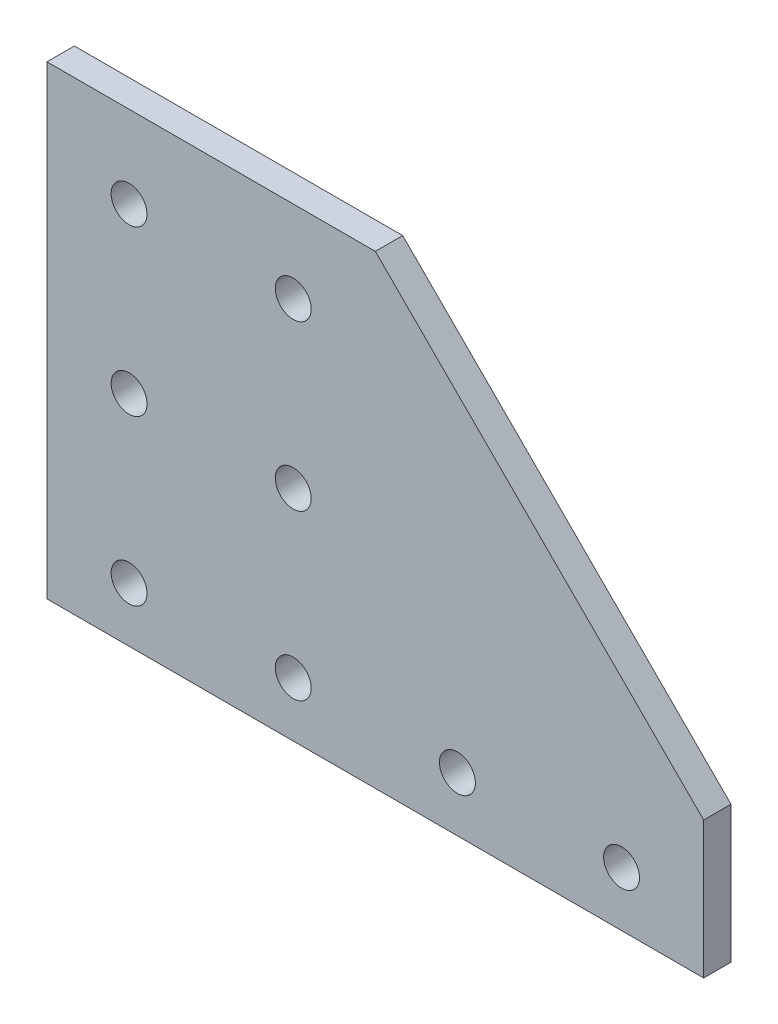
ISO-10303-21;
HEADER;
FILE_DESCRIPTION(('STEP AP214'),'2;1');
FILE_NAME('part.step','',(''),(''),'','','');
FILE_SCHEMA(('AUTOMOTIVE_DESIGN { 1 0 10303 214 1 1 1 1 }'));
ENDSEC;
DATA;
#1=APPLICATION_CONTEXT('core data for automotive mechanical design processes');
#2=APPLICATION_PROTOCOL_DEFINITION('international standard','automotive_design',2000,#1);
#3=PRODUCT_CONTEXT('',#1,'mechanical');
#4=PRODUCT('Part','Part','',(#3));
#5=PRODUCT_RELATED_PRODUCT_CATEGORY('part','',(#4));
#6=PRODUCT_DEFINITION_FORMATION('','',#4);
#7=PRODUCT_DEFINITION_CONTEXT('part definition',#1,'design');
#8=PRODUCT_DEFINITION('design','',#6,#7);
#9=PRODUCT_DEFINITION_SHAPE('','',#8);
#10=(LENGTH_UNIT() NAMED_UNIT(*) SI_UNIT(.MILLI.,.METRE.));
#11=(NAMED_UNIT(*) PLANE_ANGLE_UNIT() SI_UNIT($,.RADIAN.));
#12=(NAMED_UNIT(*) SI_UNIT($,.STERADIAN.) SOLID_ANGLE_UNIT());
#13=UNCERTAINTY_MEASURE_WITH_UNIT(LENGTH_MEASURE(1.E-05),#10,'distance_accuracy_value','');
#14=(GEOMETRIC_REPRESENTATION_CONTEXT(3) GLOBAL_UNCERTAINTY_ASSIGNED_CONTEXT((#13)) GLOBAL_UNIT_ASSIGNED_CONTEXT((#10,
#11,#12)) REPRESENTATION_CONTEXT('',''));
#15=CARTESIAN_POINT('',(0.,0.,0.));
#16=DIRECTION('',(0.,0.,1.));
#17=DIRECTION('',(1.,0.,0.));
#18=AXIS2_PLACEMENT_3D('',#15,#16,#17);
#19=CARTESIAN_POINT('',(0.,0.,3.175));
#20=DIRECTION('',(0.,0.,-1.));
#21=DIRECTION('',(-1.,0.,0.));
#22=AXIS2_PLACEMENT_3D('',#19,#20,#21);
#23=PLANE('',#22);
#24=CARTESIAN_POINT('',(57.15,133.35,3.175));
#25=DIRECTION('',(0.,0.,1.));
#26=DIRECTION('',(1.,0.,0.));
#27=AXIS2_PLACEMENT_3D('',#24,#25,#26);
#28=CIRCLE('',#27,4.1656);
#29=CARTESIAN_POINT('',(61.3156,133.35,3.175));
#30=VERTEX_POINT('',#29);
#31=EDGE_CURVE('E142',#30,#30,#28,.T.);
#32=ORIENTED_EDGE('',*,*,#31,.F.);
#33=EDGE_LOOP('',(#32));
#34=FACE_BOUND('',#33,.T.);
#35=CARTESIAN_POINT('',(57.15,57.15,3.175));
#36=DIRECTION('',(0.,0.,1.));
#37=DIRECTION('',(1.,0.,0.));
#38=AXIS2_PLACEMENT_3D('',#35,#36,#37);
#39=CIRCLE('',#38,4.1656);
#40=CARTESIAN_POINT('',(61.3156,57.15,3.175));
#41=VERTEX_POINT('',#40);
#42=EDGE_CURVE('E130',#41,#41,#39,.T.);
#43=ORIENTED_EDGE('',*,*,#42,.F.);
#44=EDGE_LOOP('',(#43));
#45=FACE_BOUND('',#44,.T.);
#46=CARTESIAN_POINT('',(133.35,57.15,3.175));
#47=DIRECTION('',(0.,0.,1.));
#48=DIRECTION('',(1.,0.,0.));
#49=AXIS2_PLACEMENT_3D('',#46,#47,#48);
#50=CIRCLE('',#49,4.1656);
#51=CARTESIAN_POINT('',(137.5156,57.15,3.175));
#52=VERTEX_POINT('',#51);
#53=EDGE_CURVE('E118',#52,#52,#50,.T.);
#54=ORIENTED_EDGE('',*,*,#53,.F.);
#55=EDGE_LOOP('',(#54));
#56=FACE_BOUND('',#55,.T.);
#57=CARTESIAN_POINT('',(19.05,95.25,3.175));
#58=DIRECTION('',(0.,0.,1.));
#59=DIRECTION('',(1.,0.,0.));
#60=AXIS2_PLACEMENT_3D('',#57,#58,#59);
#61=CIRCLE('',#60,4.1656);
#62=CARTESIAN_POINT('',(23.2156,95.25,3.175));
#63=VERTEX_POINT('',#62);
#64=EDGE_CURVE('E87',#63,#63,#61,.T.);
#65=ORIENTED_EDGE('',*,*,#64,.F.);
#66=EDGE_LOOP('',(#65));
#67=FACE_BOUND('',#66,.T.);
#68=DIRECTION('',(0.,-1.,0.));
#69=VECTOR('',#68,1.);
#70=CARTESIAN_POINT('',(0.,0.,3.175));
#71=LINE('',#70,#69);
#72=CARTESIAN_POINT('',(0.,152.4,3.175));
#73=VERTEX_POINT('',#72);
#74=CARTESIAN_POINT('',(0.,44.45,3.175));
#75=VERTEX_POINT('',#74);
#76=EDGE_CURVE('E94',#73,#75,#71,.T.);
#77=ORIENTED_EDGE('',*,*,#76,.T.);
#78=DIRECTION('',(-1.,0.,0.));
#79=VECTOR('',#78,1.);
#80=CARTESIAN_POINT('',(0.,44.45,3.175));
#81=LINE('',#80,#79);
#82=CARTESIAN_POINT('',(152.4,44.45,3.175));
#83=VERTEX_POINT('',#82);
#84=EDGE_CURVE('E31',#83,#75,#81,.T.);
#85=ORIENTED_EDGE('',*,*,#84,.F.);
#86=DIRECTION('',(0.,1.,0.));
#87=VECTOR('',#86,1.);
#88=CARTESIAN_POINT('',(152.4,76.2,3.175));
#89=LINE('',#88,#87);
#90=CARTESIAN_POINT('',(152.4,76.2,3.175));
#91=VERTEX_POINT('',#90);
#92=EDGE_CURVE('E61',#83,#91,#89,.T.);
#93=ORIENTED_EDGE('',*,*,#92,.T.);
#94=DIRECTION('',(-0.707106781186548,0.707106781186548,0.));
#95=VECTOR('',#94,1.);
#96=CARTESIAN_POINT('',(152.4,76.2,3.175));
#97=LINE('',#96,#95);
#98=CARTESIAN_POINT('',(76.2,152.4,3.175));
#99=VERTEX_POINT('',#98);
#100=EDGE_CURVE('E108',#91,#99,#97,.T.);
#101=ORIENTED_EDGE('',*,*,#100,.T.);
#102=DIRECTION('',(-1.,0.,0.));
#103=VECTOR('',#102,1.);
#104=CARTESIAN_POINT('',(0.,152.4,3.175));
#105=LINE('',#104,#103);
#106=EDGE_CURVE('E40',#99,#73,#105,.T.);
#107=ORIENTED_EDGE('',*,*,#106,.T.);
#108=EDGE_LOOP('',(#77,#85,#93,#101,#107));
#109=FACE_BOUND('',#108,.T.);
#110=CARTESIAN_POINT('',(19.05,57.15,3.175));
#111=DIRECTION('',(0.,0.,1.));
#112=DIRECTION('',(1.,0.,0.));
#113=AXIS2_PLACEMENT_3D('',#110,#111,#112);
#114=CIRCLE('',#113,4.1656);
#115=CARTESIAN_POINT('',(23.2156,57.15,3.175));
#116=VERTEX_POINT('',#115);
#117=EDGE_CURVE('E113',#116,#116,#114,.T.);
#118=ORIENTED_EDGE('',*,*,#117,.F.);
#119=EDGE_LOOP('',(#118));
#120=FACE_BOUND('',#119,.T.);
#121=CARTESIAN_POINT('',(95.25,57.15,3.175));
#122=DIRECTION('',(0.,0.,1.));
#123=DIRECTION('',(1.,0.,0.));
#124=AXIS2_PLACEMENT_3D('',#121,#122,#123);
#125=CIRCLE('',#124,4.1656);
#126=CARTESIAN_POINT('',(99.4156,57.15,3.175));
#127=VERTEX_POINT('',#126);
#128=EDGE_CURVE('E124',#127,#127,#125,.T.);
#129=ORIENTED_EDGE('',*,*,#128,.F.);
#130=EDGE_LOOP('',(#129));
#131=FACE_BOUND('',#130,.T.);
#132=CARTESIAN_POINT('',(19.05,133.35,3.175));
#133=DIRECTION('',(0.,0.,1.));
#134=DIRECTION('',(1.,0.,0.));
#135=AXIS2_PLACEMENT_3D('',#132,#133,#134);
#136=CIRCLE('',#135,4.1656);
#137=CARTESIAN_POINT('',(23.2156,133.35,3.175));
#138=VERTEX_POINT('',#137);
#139=EDGE_CURVE('E136',#138,#138,#136,.T.);
#140=ORIENTED_EDGE('',*,*,#139,.F.);
#141=EDGE_LOOP('',(#140));
#142=FACE_BOUND('',#141,.T.);
#143=CARTESIAN_POINT('',(57.15,95.25,3.175));
#144=DIRECTION('',(0.,0.,1.));
#145=DIRECTION('',(1.,0.,0.));
#146=AXIS2_PLACEMENT_3D('',#143,#144,#145);
#147=CIRCLE('',#146,4.1656);
#148=CARTESIAN_POINT('',(61.3156,95.25,3.175));
#149=VERTEX_POINT('',#148);
#150=EDGE_CURVE('E148',#149,#149,#147,.T.);
#151=ORIENTED_EDGE('',*,*,#150,.F.);
#152=EDGE_LOOP('',(#151));
#153=FACE_BOUND('',#152,.T.);
#154=ADVANCED_FACE('F16',(#34,#45,#56,#67,#109,#120,#131,#142,#153),#23,.F.);
#155=CARTESIAN_POINT('',(0.,0.,-3.175));
#156=DIRECTION('',(0.,0.,-1.));
#157=DIRECTION('',(-1.,0.,0.));
#158=AXIS2_PLACEMENT_3D('',#155,#156,#157);
#159=PLANE('',#158);
#160=DIRECTION('',(-1.,0.,0.));
#161=VECTOR('',#160,1.);
#162=CARTESIAN_POINT('',(0.,44.45,-3.175));
#163=LINE('',#162,#161);
#164=CARTESIAN_POINT('',(152.4,44.45,-3.175));
#165=VERTEX_POINT('',#164);
#166=CARTESIAN_POINT('',(0.,44.45,-3.175));
#167=VERTEX_POINT('',#166);
#168=EDGE_CURVE('E70',#165,#167,#163,.T.);
#169=ORIENTED_EDGE('',*,*,#168,.T.);
#170=DIRECTION('',(0.,-1.,0.));
#171=VECTOR('',#170,1.);
#172=CARTESIAN_POINT('',(0.,0.,-3.175));
#173=LINE('',#172,#171);
#174=CARTESIAN_POINT('',(0.,152.4,-3.175));
#175=VERTEX_POINT('',#174);
#176=EDGE_CURVE('E98',#175,#167,#173,.T.);
#177=ORIENTED_EDGE('',*,*,#176,.F.);
#178=DIRECTION('',(-1.,0.,0.));
#179=VECTOR('',#178,1.);
#180=CARTESIAN_POINT('',(0.,152.4,-3.175));
#181=LINE('',#180,#179);
#182=CARTESIAN_POINT('',(76.2,152.4,-3.175));
#183=VERTEX_POINT('',#182);
#184=EDGE_CURVE('E57',#183,#175,#181,.T.);
#185=ORIENTED_EDGE('',*,*,#184,.F.);
#186=DIRECTION('',(-0.707106781186548,0.707106781186548,0.));
#187=VECTOR('',#186,1.);
#188=CARTESIAN_POINT('',(152.4,76.2,-3.175));
#189=LINE('',#188,#187);
#190=CARTESIAN_POINT('',(152.4,76.2,-3.175));
#191=VERTEX_POINT('',#190);
#192=EDGE_CURVE('E86',#191,#183,#189,.T.);
#193=ORIENTED_EDGE('',*,*,#192,.F.);
#194=DIRECTION('',(0.,1.,0.));
#195=VECTOR('',#194,1.);
#196=CARTESIAN_POINT('',(152.4,76.2,-3.175));
#197=LINE('',#196,#195);
#198=EDGE_CURVE('E81',#165,#191,#197,.T.);
#199=ORIENTED_EDGE('',*,*,#198,.F.);
#200=EDGE_LOOP('',(#169,#177,#185,#193,#199));
#201=FACE_BOUND('',#200,.T.);
#202=CARTESIAN_POINT('',(57.15,133.35,-3.175));
#203=DIRECTION('',(0.,0.,1.));
#204=DIRECTION('',(1.,0.,0.));
#205=AXIS2_PLACEMENT_3D('',#202,#203,#204);
#206=CIRCLE('',#205,4.1656);
#207=CARTESIAN_POINT('',(61.3156,133.35,-3.175));
#208=VERTEX_POINT('',#207);
#209=EDGE_CURVE('E145',#208,#208,#206,.T.);
#210=ORIENTED_EDGE('',*,*,#209,.T.);
#211=EDGE_LOOP('',(#210));
#212=FACE_BOUND('',#211,.T.);
#213=CARTESIAN_POINT('',(57.15,57.15,-3.175));
#214=DIRECTION('',(0.,0.,1.));
#215=DIRECTION('',(1.,0.,0.));
#216=AXIS2_PLACEMENT_3D('',#213,#214,#215);
#217=CIRCLE('',#216,4.1656);
#218=CARTESIAN_POINT('',(61.3156,57.15,-3.175));
#219=VERTEX_POINT('',#218);
#220=EDGE_CURVE('E133',#219,#219,#217,.T.);
#221=ORIENTED_EDGE('',*,*,#220,.T.);
#222=EDGE_LOOP('',(#221));
#223=FACE_BOUND('',#222,.T.);
#224=CARTESIAN_POINT('',(133.35,57.15,-3.175));
#225=DIRECTION('',(0.,0.,1.));
#226=DIRECTION('',(1.,0.,0.));
#227=AXIS2_PLACEMENT_3D('',#224,#225,#226);
#228=CIRCLE('',#227,4.1656);
#229=CARTESIAN_POINT('',(137.5156,57.15,-3.175));
#230=VERTEX_POINT('',#229);
#231=EDGE_CURVE('E121',#230,#230,#228,.T.);
#232=ORIENTED_EDGE('',*,*,#231,.T.);
#233=EDGE_LOOP('',(#232));
#234=FACE_BOUND('',#233,.T.);
#235=CARTESIAN_POINT('',(19.05,95.25,-3.175));
#236=DIRECTION('',(0.,0.,1.));
#237=DIRECTION('',(1.,0.,0.));
#238=AXIS2_PLACEMENT_3D('',#235,#236,#237);
#239=CIRCLE('',#238,4.1656);
#240=CARTESIAN_POINT('',(23.2156,95.25,-3.175));
#241=VERTEX_POINT('',#240);
#242=EDGE_CURVE('E91',#241,#241,#239,.T.);
#243=ORIENTED_EDGE('',*,*,#242,.T.);
#244=EDGE_LOOP('',(#243));
#245=FACE_BOUND('',#244,.T.);
#246=CARTESIAN_POINT('',(19.05,57.15,-3.175));
#247=DIRECTION('',(0.,0.,1.));
#248=DIRECTION('',(1.,0.,0.));
#249=AXIS2_PLACEMENT_3D('',#246,#247,#248);
#250=CIRCLE('',#249,4.1656);
#251=CARTESIAN_POINT('',(23.2156,57.15,-3.175));
#252=VERTEX_POINT('',#251);
#253=EDGE_CURVE('E115',#252,#252,#250,.T.);
#254=ORIENTED_EDGE('',*,*,#253,.T.);
#255=EDGE_LOOP('',(#254));
#256=FACE_BOUND('',#255,.T.);
#257=CARTESIAN_POINT('',(95.25,57.15,-3.175));
#258=DIRECTION('',(0.,0.,1.));
#259=DIRECTION('',(1.,0.,0.));
#260=AXIS2_PLACEMENT_3D('',#257,#258,#259);
#261=CIRCLE('',#260,4.1656);
#262=CARTESIAN_POINT('',(99.4156,57.15,-3.175));
#263=VERTEX_POINT('',#262);
#264=EDGE_CURVE('E127',#263,#263,#261,.T.);
#265=ORIENTED_EDGE('',*,*,#264,.T.);
#266=EDGE_LOOP('',(#265));
#267=FACE_BOUND('',#266,.T.);
#268=CARTESIAN_POINT('',(19.05,133.35,-3.175));
#269=DIRECTION('',(0.,0.,1.));
#270=DIRECTION('',(1.,0.,0.));
#271=AXIS2_PLACEMENT_3D('',#268,#269,#270);
#272=CIRCLE('',#271,4.1656);
#273=CARTESIAN_POINT('',(23.2156,133.35,-3.175));
#274=VERTEX_POINT('',#273);
#275=EDGE_CURVE('E139',#274,#274,#272,.T.);
#276=ORIENTED_EDGE('',*,*,#275,.T.);
#277=EDGE_LOOP('',(#276));
#278=FACE_BOUND('',#277,.T.);
#279=CARTESIAN_POINT('',(57.15,95.25,-3.175));
#280=DIRECTION('',(0.,0.,1.));
#281=DIRECTION('',(1.,0.,0.));
#282=AXIS2_PLACEMENT_3D('',#279,#280,#281);
#283=CIRCLE('',#282,4.1656);
#284=CARTESIAN_POINT('',(61.3156,95.25,-3.175));
#285=VERTEX_POINT('',#284);
#286=EDGE_CURVE('E151',#285,#285,#283,.T.);
#287=ORIENTED_EDGE('',*,*,#286,.T.);
#288=EDGE_LOOP('',(#287));
#289=FACE_BOUND('',#288,.T.);
#290=ADVANCED_FACE('F84',(#201,#212,#223,#234,#245,#256,#267,#278,#289),#159,.T.);
#291=CARTESIAN_POINT('',(152.4,76.2,3.175));
#292=DIRECTION('',(-1.,0.,0.));
#293=DIRECTION('',(0.,0.,1.));
#294=AXIS2_PLACEMENT_3D('',#291,#292,#293);
#295=PLANE('',#294);
#296=ORIENTED_EDGE('',*,*,#92,.F.);
#297=DIRECTION('',(0.,0.,1.));
#298=VECTOR('',#297,1.);
#299=CARTESIAN_POINT('',(152.4,44.45,-3.175));
#300=LINE('',#299,#298);
#301=EDGE_CURVE('E73',#165,#83,#300,.T.);
#302=ORIENTED_EDGE('',*,*,#301,.F.);
#303=ORIENTED_EDGE('',*,*,#198,.T.);
#304=DIRECTION('',(0.,0.,-1.));
#305=VECTOR('',#304,1.);
#306=CARTESIAN_POINT('',(152.4,76.2,3.175));
#307=LINE('',#306,#305);
#308=EDGE_CURVE('E11',#91,#191,#307,.T.);
#309=ORIENTED_EDGE('',*,*,#308,.F.);
#310=EDGE_LOOP('',(#296,#302,#303,#309));
#311=FACE_BOUND('',#310,.T.);
#312=ADVANCED_FACE('F18',(#311),#295,.F.);
#313=CARTESIAN_POINT('',(152.4,76.2,3.175));
#314=DIRECTION('',(-0.707106781186548,-0.707106781186548,0.));
#315=DIRECTION('',(0.707106781186548,-0.707106781186548,0.));
#316=AXIS2_PLACEMENT_3D('',#313,#314,#315);
#317=PLANE('',#316);
#318=ORIENTED_EDGE('',*,*,#192,.T.);
#319=DIRECTION('',(0.,0.,-1.));
#320=VECTOR('',#319,1.);
#321=CARTESIAN_POINT('',(76.2,152.4,3.175));
#322=LINE('',#321,#320);
#323=EDGE_CURVE('E24',#99,#183,#322,.T.);
#324=ORIENTED_EDGE('',*,*,#323,.F.);
#325=ORIENTED_EDGE('',*,*,#100,.F.);
#326=ORIENTED_EDGE('',*,*,#308,.T.);
#327=EDGE_LOOP('',(#318,#324,#325,#326));
#328=FACE_BOUND('',#327,.T.);
#329=ADVANCED_FACE('F180',(#328),#317,.F.);
#330=CARTESIAN_POINT('',(0.,152.4,3.175));
#331=DIRECTION('',(0.,-1.,0.));
#332=DIRECTION('',(0.,0.,-1.));
#333=AXIS2_PLACEMENT_3D('',#330,#331,#332);
#334=PLANE('',#333);
#335=ORIENTED_EDGE('',*,*,#184,.T.);
#336=DIRECTION('',(0.,0.,-1.));
#337=VECTOR('',#336,1.);
#338=CARTESIAN_POINT('',(0.,152.4,3.175));
#339=LINE('',#338,#337);
#340=EDGE_CURVE('E100',#73,#175,#339,.T.);
#341=ORIENTED_EDGE('',*,*,#340,.F.);
#342=ORIENTED_EDGE('',*,*,#106,.F.);
#343=ORIENTED_EDGE('',*,*,#323,.T.);
#344=EDGE_LOOP('',(#335,#341,#342,#343));
#345=FACE_BOUND('',#344,.T.);
#346=ADVANCED_FACE('F102',(#345),#334,.F.);
#347=CARTESIAN_POINT('',(0.,0.,3.175));
#348=DIRECTION('',(1.,0.,0.));
#349=DIRECTION('',(0.,0.,-1.));
#350=AXIS2_PLACEMENT_3D('',#347,#348,#349);
#351=PLANE('',#350);
#352=ORIENTED_EDGE('',*,*,#176,.T.);
#353=DIRECTION('',(0.,0.,1.));
#354=VECTOR('',#353,1.);
#355=CARTESIAN_POINT('',(0.,44.45,-3.175));
#356=LINE('',#355,#354);
#357=EDGE_CURVE('E74',#167,#75,#356,.T.);
#358=ORIENTED_EDGE('',*,*,#357,.T.);
#359=ORIENTED_EDGE('',*,*,#76,.F.);
#360=ORIENTED_EDGE('',*,*,#340,.T.);
#361=EDGE_LOOP('',(#352,#358,#359,#360));
#362=FACE_BOUND('',#361,.T.);
#363=ADVANCED_FACE('F106',(#362),#351,.F.);
#364=CARTESIAN_POINT('',(19.05,95.25,3.175));
#365=DIRECTION('',(0.,0.,-1.));
#366=DIRECTION('',(-1.,0.,0.));
#367=AXIS2_PLACEMENT_3D('',#364,#365,#366);
#368=CYLINDRICAL_SURFACE('',#367,4.1656);
#369=ORIENTED_EDGE('',*,*,#64,.T.);
#370=EDGE_LOOP('',(#369));
#371=FACE_BOUND('',#370,.T.);
#372=ORIENTED_EDGE('',*,*,#242,.F.);
#373=EDGE_LOOP('',(#372));
#374=FACE_BOUND('',#373,.T.);
#375=ADVANCED_FACE('F174',(#371,#374),#368,.F.);
#376=CARTESIAN_POINT('',(19.05,57.15,3.175));
#377=DIRECTION('',(0.,0.,-1.));
#378=DIRECTION('',(-1.,0.,0.));
#379=AXIS2_PLACEMENT_3D('',#376,#377,#378);
#380=CYLINDRICAL_SURFACE('',#379,4.1656);
#381=ORIENTED_EDGE('',*,*,#117,.T.);
#382=EDGE_LOOP('',(#381));
#383=FACE_BOUND('',#382,.T.);
#384=ORIENTED_EDGE('',*,*,#253,.F.);
#385=EDGE_LOOP('',(#384));
#386=FACE_BOUND('',#385,.T.);
#387=ADVANCED_FACE('F223',(#383,#386),#380,.F.);
#388=CARTESIAN_POINT('',(133.35,57.15,3.175));
#389=DIRECTION('',(0.,0.,-1.));
#390=DIRECTION('',(-1.,0.,0.));
#391=AXIS2_PLACEMENT_3D('',#388,#389,#390);
#392=CYLINDRICAL_SURFACE('',#391,4.1656);
#393=ORIENTED_EDGE('',*,*,#53,.T.);
#394=EDGE_LOOP('',(#393));
#395=FACE_BOUND('',#394,.T.);
#396=ORIENTED_EDGE('',*,*,#231,.F.);
#397=EDGE_LOOP('',(#396));
#398=FACE_BOUND('',#397,.T.);
#399=ADVANCED_FACE('F220',(#395,#398),#392,.F.);
#400=CARTESIAN_POINT('',(95.25,57.15,3.175));
#401=DIRECTION('',(0.,0.,-1.));
#402=DIRECTION('',(-1.,0.,0.));
#403=AXIS2_PLACEMENT_3D('',#400,#401,#402);
#404=CYLINDRICAL_SURFACE('',#403,4.1656);
#405=ORIENTED_EDGE('',*,*,#128,.T.);
#406=EDGE_LOOP('',(#405));
#407=FACE_BOUND('',#406,.T.);
#408=ORIENTED_EDGE('',*,*,#264,.F.);
#409=EDGE_LOOP('',(#408));
#410=FACE_BOUND('',#409,.T.);
#411=ADVANCED_FACE('F216',(#407,#410),#404,.F.);
#412=CARTESIAN_POINT('',(57.15,57.15,3.175));
#413=DIRECTION('',(0.,0.,-1.));
#414=DIRECTION('',(-1.,0.,0.));
#415=AXIS2_PLACEMENT_3D('',#412,#413,#414);
#416=CYLINDRICAL_SURFACE('',#415,4.1656);
#417=ORIENTED_EDGE('',*,*,#42,.T.);
#418=EDGE_LOOP('',(#417));
#419=FACE_BOUND('',#418,.T.);
#420=ORIENTED_EDGE('',*,*,#220,.F.);
#421=EDGE_LOOP('',(#420));
#422=FACE_BOUND('',#421,.T.);
#423=ADVANCED_FACE('F197',(#419,#422),#416,.F.);
#424=CARTESIAN_POINT('',(19.05,133.35,3.175));
#425=DIRECTION('',(0.,0.,-1.));
#426=DIRECTION('',(-1.,0.,0.));
#427=AXIS2_PLACEMENT_3D('',#424,#425,#426);
#428=CYLINDRICAL_SURFACE('',#427,4.1656);
#429=ORIENTED_EDGE('',*,*,#139,.T.);
#430=EDGE_LOOP('',(#429));
#431=FACE_BOUND('',#430,.T.);
#432=ORIENTED_EDGE('',*,*,#275,.F.);
#433=EDGE_LOOP('',(#432));
#434=FACE_BOUND('',#433,.T.);
#435=ADVANCED_FACE('F193',(#431,#434),#428,.F.);
#436=CARTESIAN_POINT('',(57.15,133.35,3.175));
#437=DIRECTION('',(0.,0.,-1.));
#438=DIRECTION('',(-1.,0.,0.));
#439=AXIS2_PLACEMENT_3D('',#436,#437,#438);
#440=CYLINDRICAL_SURFACE('',#439,4.1656);
#441=ORIENTED_EDGE('',*,*,#31,.T.);
#442=EDGE_LOOP('',(#441));
#443=FACE_BOUND('',#442,.T.);
#444=ORIENTED_EDGE('',*,*,#209,.F.);
#445=EDGE_LOOP('',(#444));
#446=FACE_BOUND('',#445,.T.);
#447=ADVANCED_FACE('F196',(#443,#446),#440,.F.);
#448=CARTESIAN_POINT('',(57.15,95.25,3.175));
#449=DIRECTION('',(0.,0.,-1.));
#450=DIRECTION('',(-1.,0.,0.));
#451=AXIS2_PLACEMENT_3D('',#448,#449,#450);
#452=CYLINDRICAL_SURFACE('',#451,4.1656);
#453=ORIENTED_EDGE('',*,*,#150,.T.);
#454=EDGE_LOOP('',(#453));
#455=FACE_BOUND('',#454,.T.);
#456=ORIENTED_EDGE('',*,*,#286,.F.);
#457=EDGE_LOOP('',(#456));
#458=FACE_BOUND('',#457,.T.);
#459=ADVANCED_FACE('F159',(#455,#458),#452,.F.);
#460=CARTESIAN_POINT('',(0.,44.45,-3.175));
#461=DIRECTION('',(0.,1.,0.));
#462=DIRECTION('',(0.,0.,1.));
#463=AXIS2_PLACEMENT_3D('',#460,#461,#462);
#464=PLANE('',#463);
#465=ORIENTED_EDGE('',*,*,#84,.T.);
#466=ORIENTED_EDGE('',*,*,#357,.F.);
#467=ORIENTED_EDGE('',*,*,#168,.F.);
#468=ORIENTED_EDGE('',*,*,#301,.T.);
#469=EDGE_LOOP('',(#465,#466,#467,#468));
#470=FACE_BOUND('',#469,.T.);
#471=ADVANCED_FACE('F72',(#470),#464,.F.);
#472=CLOSED_SHELL('',(#154,#290,#312,#329,#346,#363,#375,#387,#399,#411,#423,#435,#447,#459,#471));
#473=MANIFOLD_SOLID_BREP('B1',#472);
#474=ADVANCED_BREP_SHAPE_REPRESENTATION('',(#18,#473),#14);
#475=SHAPE_DEFINITION_REPRESENTATION(#9,#474);
ENDSEC;
END-ISO-10303-21;
